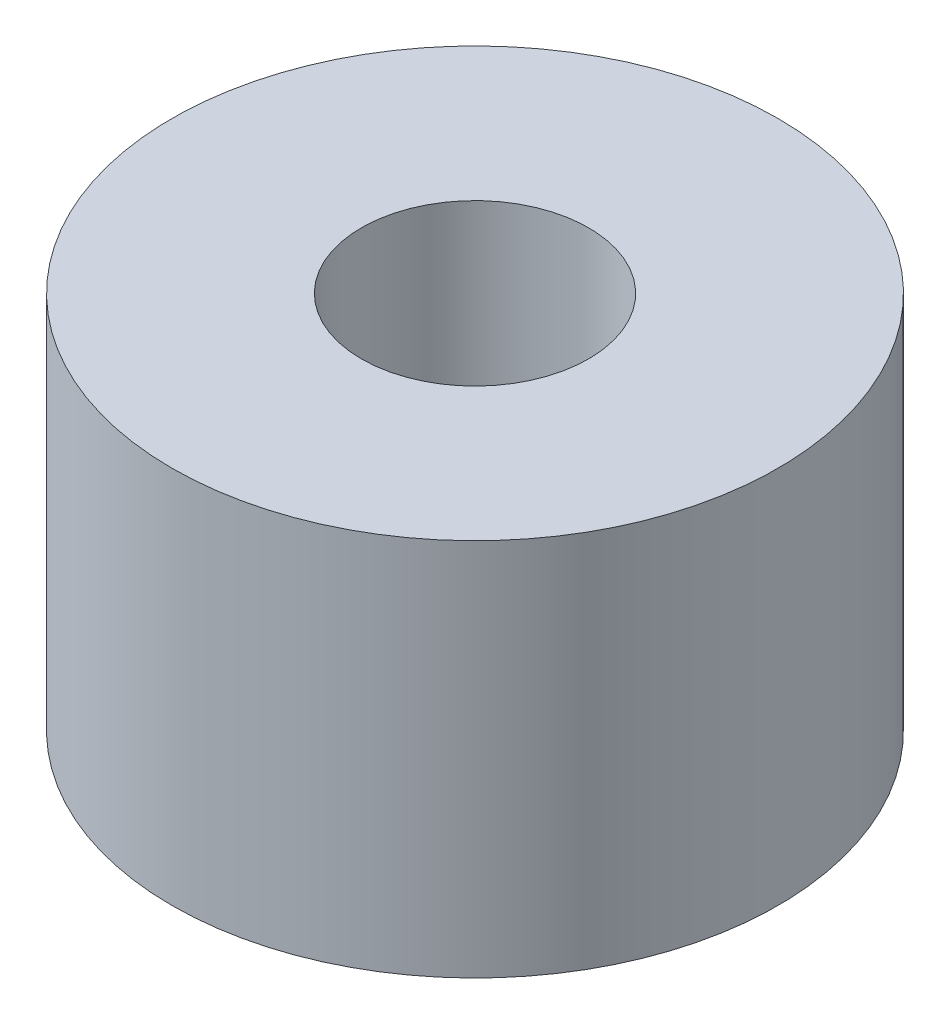
ISO-10303-21;
HEADER;
FILE_DESCRIPTION(('STEP AP214'),'2;1');
FILE_NAME('part.step','',(''),(''),'','','');
FILE_SCHEMA(('AUTOMOTIVE_DESIGN { 1 0 10303 214 1 1 1 1 }'));
ENDSEC;
DATA;
#1=APPLICATION_CONTEXT('core data for automotive mechanical design processes');
#2=APPLICATION_PROTOCOL_DEFINITION('international standard','automotive_design',2000,#1);
#3=PRODUCT_CONTEXT('',#1,'mechanical');
#4=PRODUCT('Part','Part','',(#3));
#5=PRODUCT_RELATED_PRODUCT_CATEGORY('part','',(#4));
#6=PRODUCT_DEFINITION_FORMATION('','',#4);
#7=PRODUCT_DEFINITION_CONTEXT('part definition',#1,'design');
#8=PRODUCT_DEFINITION('design','',#6,#7);
#9=PRODUCT_DEFINITION_SHAPE('','',#8);
#10=(LENGTH_UNIT() NAMED_UNIT(*) SI_UNIT(.MILLI.,.METRE.));
#11=(NAMED_UNIT(*) PLANE_ANGLE_UNIT() SI_UNIT($,.RADIAN.));
#12=(NAMED_UNIT(*) SI_UNIT($,.STERADIAN.) SOLID_ANGLE_UNIT());
#13=UNCERTAINTY_MEASURE_WITH_UNIT(LENGTH_MEASURE(1.E-05),#10,'distance_accuracy_value','');
#14=(GEOMETRIC_REPRESENTATION_CONTEXT(3) GLOBAL_UNCERTAINTY_ASSIGNED_CONTEXT((#13)) GLOBAL_UNIT_ASSIGNED_CONTEXT((#10,
#11,#12)) REPRESENTATION_CONTEXT('',''));
#15=CARTESIAN_POINT('',(0.,0.,0.));
#16=DIRECTION('',(0.,0.,1.));
#17=DIRECTION('',(1.,0.,0.));
#18=AXIS2_PLACEMENT_3D('',#15,#16,#17);
#19=CARTESIAN_POINT('',(0.,5.,0.));
#20=DIRECTION('',(0.,1.,0.));
#21=DIRECTION('',(0.,0.,1.));
#22=AXIS2_PLACEMENT_3D('',#19,#20,#21);
#23=PLANE('',#22);
#24=CARTESIAN_POINT('',(0.,5.,0.));
#25=DIRECTION('',(0.,1.,0.));
#26=DIRECTION('',(0.,0.,1.));
#27=AXIS2_PLACEMENT_3D('',#24,#25,#26);
#28=CIRCLE('',#27,4.);
#29=CARTESIAN_POINT('',(0.,5.,4.));
#30=VERTEX_POINT('',#29);
#31=EDGE_CURVE('E10',#30,#30,#28,.T.);
#32=ORIENTED_EDGE('',*,*,#31,.T.);
#33=EDGE_LOOP('',(#32));
#34=FACE_BOUND('',#33,.T.);
#35=CARTESIAN_POINT('',(0.,5.,0.));
#36=DIRECTION('',(0.,1.,0.));
#37=DIRECTION('',(0.,0.,1.));
#38=AXIS2_PLACEMENT_3D('',#35,#36,#37);
#39=CIRCLE('',#38,1.5);
#40=CARTESIAN_POINT('',(0.,5.,1.5));
#41=VERTEX_POINT('',#40);
#42=EDGE_CURVE('E44',#41,#41,#39,.T.);
#43=ORIENTED_EDGE('',*,*,#42,.F.);
#44=EDGE_LOOP('',(#43));
#45=FACE_BOUND('',#44,.T.);
#46=ADVANCED_FACE('F33',(#34,#45),#23,.T.);
#47=CARTESIAN_POINT('',(0.,0.,0.));
#48=DIRECTION('',(0.,1.,0.));
#49=DIRECTION('',(0.,0.,1.));
#50=AXIS2_PLACEMENT_3D('',#47,#48,#49);
#51=PLANE('',#50);
#52=CARTESIAN_POINT('',(0.,0.,0.));
#53=DIRECTION('',(0.,1.,0.));
#54=DIRECTION('',(0.,0.,1.));
#55=AXIS2_PLACEMENT_3D('',#52,#53,#54);
#56=CIRCLE('',#55,4.);
#57=CARTESIAN_POINT('',(0.,0.,4.));
#58=VERTEX_POINT('',#57);
#59=EDGE_CURVE('E37',#58,#58,#56,.T.);
#60=ORIENTED_EDGE('',*,*,#59,.F.);
#61=EDGE_LOOP('',(#60));
#62=FACE_BOUND('',#61,.T.);
#63=CARTESIAN_POINT('',(0.,0.,0.));
#64=DIRECTION('',(0.,1.,0.));
#65=DIRECTION('',(0.,0.,1.));
#66=AXIS2_PLACEMENT_3D('',#63,#64,#65);
#67=CIRCLE('',#66,1.5);
#68=CARTESIAN_POINT('',(0.,0.,1.5));
#69=VERTEX_POINT('',#68);
#70=EDGE_CURVE('E46',#69,#69,#67,.T.);
#71=ORIENTED_EDGE('',*,*,#70,.T.);
#72=EDGE_LOOP('',(#71));
#73=FACE_BOUND('',#72,.T.);
#74=ADVANCED_FACE('F56',(#62,#73),#51,.F.);
#75=CARTESIAN_POINT('',(0.,5.,0.));
#76=DIRECTION('',(0.,-1.,0.));
#77=DIRECTION('',(0.,0.,-1.));
#78=AXIS2_PLACEMENT_3D('',#75,#76,#77);
#79=CYLINDRICAL_SURFACE('',#78,4.);
#80=ORIENTED_EDGE('',*,*,#31,.F.);
#81=EDGE_LOOP('',(#80));
#82=FACE_BOUND('',#81,.T.);
#83=ORIENTED_EDGE('',*,*,#59,.T.);
#84=EDGE_LOOP('',(#83));
#85=FACE_BOUND('',#84,.T.);
#86=ADVANCED_FACE('F35',(#82,#85),#79,.T.);
#87=CARTESIAN_POINT('',(0.,5.,0.));
#88=DIRECTION('',(0.,-1.,0.));
#89=DIRECTION('',(0.,0.,-1.));
#90=AXIS2_PLACEMENT_3D('',#87,#88,#89);
#91=CYLINDRICAL_SURFACE('',#90,1.5);
#92=ORIENTED_EDGE('',*,*,#42,.T.);
#93=EDGE_LOOP('',(#92));
#94=FACE_BOUND('',#93,.T.);
#95=ORIENTED_EDGE('',*,*,#70,.F.);
#96=EDGE_LOOP('',(#95));
#97=FACE_BOUND('',#96,.T.);
#98=ADVANCED_FACE('F52',(#94,#97),#91,.F.);
#99=CLOSED_SHELL('',(#46,#74,#86,#98));
#100=MANIFOLD_SOLID_BREP('B2',#99);
#101=ADVANCED_BREP_SHAPE_REPRESENTATION('',(#18,#100),#14);
#102=SHAPE_DEFINITION_REPRESENTATION(#9,#101);
ENDSEC;
END-ISO-10303-21;
